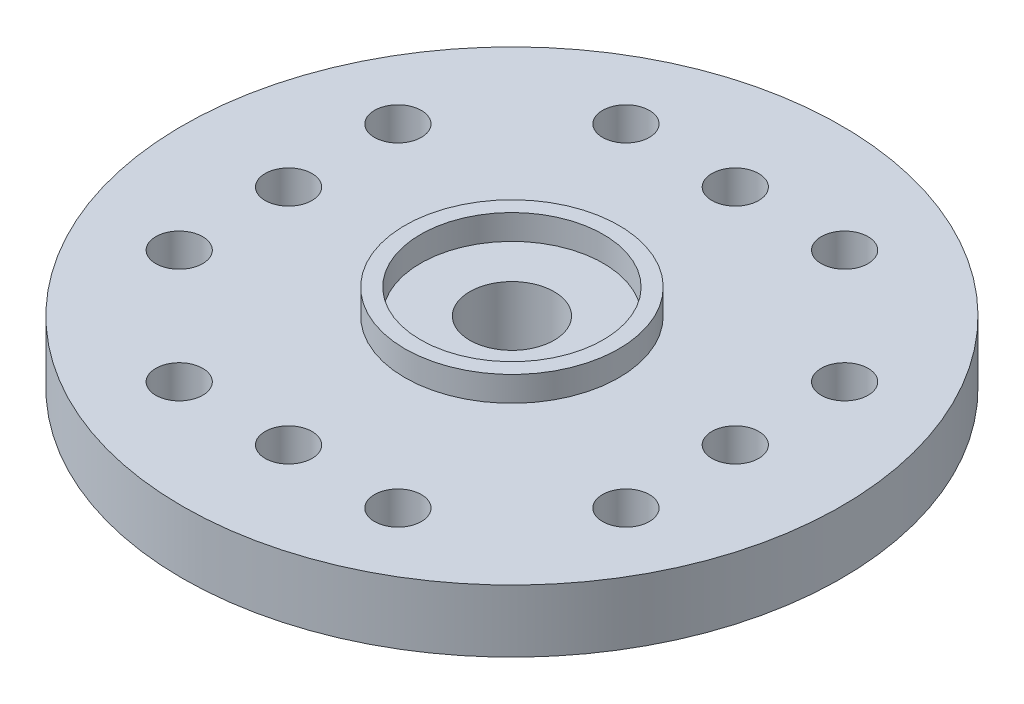
ISO-10303-21;
HEADER;
FILE_DESCRIPTION(('STEP AP214'),'2;1');
FILE_NAME('part.step','',(''),(''),'','','');
FILE_SCHEMA(('AUTOMOTIVE_DESIGN { 1 0 10303 214 1 1 1 1 }'));
ENDSEC;
DATA;
#1=APPLICATION_CONTEXT('core data for automotive mechanical design processes');
#2=APPLICATION_PROTOCOL_DEFINITION('international standard','automotive_design',2000,#1);
#3=PRODUCT_CONTEXT('',#1,'mechanical');
#4=PRODUCT('Part','Part','',(#3));
#5=PRODUCT_RELATED_PRODUCT_CATEGORY('part','',(#4));
#6=PRODUCT_DEFINITION_FORMATION('','',#4);
#7=PRODUCT_DEFINITION_CONTEXT('part definition',#1,'design');
#8=PRODUCT_DEFINITION('design','',#6,#7);
#9=PRODUCT_DEFINITION_SHAPE('','',#8);
#10=(LENGTH_UNIT() NAMED_UNIT(*) SI_UNIT(.MILLI.,.METRE.));
#11=(NAMED_UNIT(*) PLANE_ANGLE_UNIT() SI_UNIT($,.RADIAN.));
#12=(NAMED_UNIT(*) SI_UNIT($,.STERADIAN.) SOLID_ANGLE_UNIT());
#13=UNCERTAINTY_MEASURE_WITH_UNIT(LENGTH_MEASURE(1.E-05),#10,'distance_accuracy_value','');
#14=(GEOMETRIC_REPRESENTATION_CONTEXT(3) GLOBAL_UNCERTAINTY_ASSIGNED_CONTEXT((#13)) GLOBAL_UNIT_ASSIGNED_CONTEXT((#10,
#11,#12)) REPRESENTATION_CONTEXT('',''));
#15=CARTESIAN_POINT('',(0.,0.,0.));
#16=DIRECTION('',(0.,0.,1.));
#17=DIRECTION('',(1.,0.,0.));
#18=AXIS2_PLACEMENT_3D('',#15,#16,#17);
#19=CARTESIAN_POINT('',(0.,4.6,0.));
#20=DIRECTION('',(0.,1.,0.));
#21=DIRECTION('',(0.,0.,1.));
#22=AXIS2_PLACEMENT_3D('',#19,#20,#21);
#23=PLANE('',#22);
#24=CARTESIAN_POINT('',(0.,4.6,0.));
#25=DIRECTION('',(0.,1.,0.));
#26=DIRECTION('',(0.,0.,1.));
#27=AXIS2_PLACEMENT_3D('',#24,#25,#26);
#28=CIRCLE('',#27,1.35);
#29=CARTESIAN_POINT('',(0.,4.6,1.35));
#30=VERTEX_POINT('',#29);
#31=EDGE_CURVE('E123',#30,#30,#28,.T.);
#32=ORIENTED_EDGE('',*,*,#31,.F.);
#33=EDGE_LOOP('',(#32));
#34=FACE_BOUND('',#33,.T.);
#35=CARTESIAN_POINT('',(0.,4.6,0.));
#36=DIRECTION('',(0.,1.,0.));
#37=DIRECTION('',(0.,0.,1.));
#38=AXIS2_PLACEMENT_3D('',#35,#36,#37);
#39=CIRCLE('',#38,2.925);
#40=CARTESIAN_POINT('',(0.,4.6,2.925));
#41=VERTEX_POINT('',#40);
#42=EDGE_CURVE('E10',#41,#41,#39,.F.);
#43=ORIENTED_EDGE('',*,*,#42,.F.);
#44=EDGE_LOOP('',(#43));
#45=FACE_BOUND('',#44,.T.);
#46=ADVANCED_FACE('F37',(#34,#45),#23,.T.);
#47=CARTESIAN_POINT('',(0.,2.6,0.));
#48=DIRECTION('',(0.,-1.,0.));
#49=DIRECTION('',(0.,0.,-1.));
#50=AXIS2_PLACEMENT_3D('',#47,#48,#49);
#51=CYLINDRICAL_SURFACE('',#50,4.35);
#52=CARTESIAN_POINT('',(0.,2.6,0.));
#53=DIRECTION('',(0.,1.,0.));
#54=DIRECTION('',(0.,0.,1.));
#55=AXIS2_PLACEMENT_3D('',#52,#53,#54);
#56=CIRCLE('',#55,4.35);
#57=CARTESIAN_POINT('',(0.,2.6,4.35));
#58=VERTEX_POINT('',#57);
#59=EDGE_CURVE('E46',#58,#58,#56,.T.);
#60=ORIENTED_EDGE('',*,*,#59,.F.);
#61=EDGE_LOOP('',(#60));
#62=FACE_BOUND('',#61,.T.);
#63=CARTESIAN_POINT('',(0.,0.,0.));
#64=DIRECTION('',(0.,1.,0.));
#65=DIRECTION('',(0.,0.,1.));
#66=AXIS2_PLACEMENT_3D('',#63,#64,#65);
#67=CIRCLE('',#66,4.35);
#68=CARTESIAN_POINT('',(0.,0.,4.35));
#69=VERTEX_POINT('',#68);
#70=EDGE_CURVE('E52',#69,#69,#67,.T.);
#71=ORIENTED_EDGE('',*,*,#70,.T.);
#72=EDGE_LOOP('',(#71));
#73=FACE_BOUND('',#72,.T.);
#74=ADVANCED_FACE('F39',(#62,#73),#51,.T.);
#75=CARTESIAN_POINT('',(0.,0.,0.));
#76=DIRECTION('',(0.,1.,0.));
#77=DIRECTION('',(0.,0.,1.));
#78=AXIS2_PLACEMENT_3D('',#75,#76,#77);
#79=PLANE('',#78);
#80=CARTESIAN_POINT('',(0.,0.,0.));
#81=DIRECTION('',(0.,-1.,0.));
#82=DIRECTION('',(0.,0.,-1.));
#83=AXIS2_PLACEMENT_3D('',#80,#81,#82);
#84=CIRCLE('',#83,2.45);
#85=CARTESIAN_POINT('',(0.,0.,-2.45));
#86=VERTEX_POINT('',#85);
#87=EDGE_CURVE('E139',#86,#86,#84,.T.);
#88=ORIENTED_EDGE('',*,*,#87,.F.);
#89=EDGE_LOOP('',(#88));
#90=FACE_BOUND('',#89,.T.);
#91=ORIENTED_EDGE('',*,*,#70,.F.);
#92=EDGE_LOOP('',(#91));
#93=FACE_BOUND('',#92,.T.);
#94=ADVANCED_FACE('F162',(#90,#93),#79,.F.);
#95=CARTESIAN_POINT('',(0.,3.,0.));
#96=DIRECTION('',(0.,-1.,0.));
#97=DIRECTION('',(0.,0.,-1.));
#98=AXIS2_PLACEMENT_3D('',#95,#96,#97);
#99=CYLINDRICAL_SURFACE('',#98,2.45);
#100=CARTESIAN_POINT('',(0.,2.6,0.));
#101=DIRECTION('',(0.,1.,0.));
#102=DIRECTION('',(0.,0.,1.));
#103=AXIS2_PLACEMENT_3D('',#100,#101,#102);
#104=CIRCLE('',#103,2.45);
#105=CARTESIAN_POINT('',(0.,2.6,2.45));
#106=VERTEX_POINT('',#105);
#107=EDGE_CURVE('E135',#106,#106,#104,.T.);
#108=ORIENTED_EDGE('',*,*,#107,.T.);
#109=EDGE_LOOP('',(#108));
#110=FACE_BOUND('',#109,.T.);
#111=ORIENTED_EDGE('',*,*,#87,.T.);
#112=EDGE_LOOP('',(#111));
#113=FACE_BOUND('',#112,.T.);
#114=ADVANCED_FACE('F147',(#110,#113),#99,.F.);
#115=CARTESIAN_POINT('',(0.,2.6,0.));
#116=DIRECTION('',(0.,1.,0.));
#117=DIRECTION('',(0.,0.,1.));
#118=AXIS2_PLACEMENT_3D('',#115,#116,#117);
#119=PLANE('',#118);
#120=CARTESIAN_POINT('',(0.,2.6,0.));
#121=DIRECTION('',(0.,1.,0.));
#122=DIRECTION('',(0.,0.,1.));
#123=AXIS2_PLACEMENT_3D('',#120,#121,#122);
#124=CIRCLE('',#123,1.35);
#125=CARTESIAN_POINT('',(0.,2.6,1.35));
#126=VERTEX_POINT('',#125);
#127=EDGE_CURVE('E121',#126,#126,#124,.T.);
#128=ORIENTED_EDGE('',*,*,#127,.T.);
#129=EDGE_LOOP('',(#128));
#130=FACE_BOUND('',#129,.T.);
#131=ORIENTED_EDGE('',*,*,#107,.F.);
#132=EDGE_LOOP('',(#131));
#133=FACE_BOUND('',#132,.T.);
#134=ADVANCED_FACE('F150',(#130,#133),#119,.F.);
#135=CARTESIAN_POINT('',(-7.15,4.6,3.50000000000001));
#136=DIRECTION('',(0.,1.,0.));
#137=DIRECTION('',(0.,0.,1.));
#138=AXIS2_PLACEMENT_3D('',#135,#136,#137);
#139=CIRCLE('',#138,0.75);
#140=CARTESIAN_POINT('',(-7.15,4.6,4.25000000000001));
#141=VERTEX_POINT('',#140);
#142=EDGE_CURVE('E449',#141,#141,#139,.T.);
#143=ORIENTED_EDGE('',*,*,#142,.F.);
#144=EDGE_LOOP('',(#143));
#145=FACE_BOUND('',#144,.T.);
#146=CARTESIAN_POINT('',(-7.15,4.6,-3.49999999999999));
#147=DIRECTION('',(0.,1.,0.));
#148=DIRECTION('',(0.,0.,1.));
#149=AXIS2_PLACEMENT_3D('',#146,#147,#148);
#150=CIRCLE('',#149,0.75);
#151=CARTESIAN_POINT('',(-7.15,4.6,-2.74999999999999));
#152=VERTEX_POINT('',#151);
#153=EDGE_CURVE('E446',#152,#152,#150,.T.);
#154=ORIENTED_EDGE('',*,*,#153,.F.);
#155=EDGE_LOOP('',(#154));
#156=FACE_BOUND('',#155,.T.);
#157=CARTESIAN_POINT('',(-7.15,4.6,0.));
#158=DIRECTION('',(0.,1.,0.));
#159=DIRECTION('',(0.,0.,1.));
#160=AXIS2_PLACEMENT_3D('',#157,#158,#159);
#161=CIRCLE('',#160,0.75);
#162=CARTESIAN_POINT('',(-7.15,4.6,0.75));
#163=VERTEX_POINT('',#162);
#164=EDGE_CURVE('E421',#163,#163,#161,.T.);
#165=ORIENTED_EDGE('',*,*,#164,.F.);
#166=EDGE_LOOP('',(#165));
#167=FACE_BOUND('',#166,.T.);
#168=CARTESIAN_POINT('',(3.5,4.6,-7.15));
#169=DIRECTION('',(0.,1.,0.));
#170=DIRECTION('',(0.,0.,1.));
#171=AXIS2_PLACEMENT_3D('',#168,#169,#170);
#172=CIRCLE('',#171,0.750000000000001);
#173=CARTESIAN_POINT('',(3.5,4.6,-6.4));
#174=VERTEX_POINT('',#173);
#175=EDGE_CURVE('E428',#174,#174,#172,.T.);
#176=ORIENTED_EDGE('',*,*,#175,.F.);
#177=EDGE_LOOP('',(#176));
#178=FACE_BOUND('',#177,.T.);
#179=CARTESIAN_POINT('',(-3.5,4.6,-7.15));
#180=DIRECTION('',(0.,1.,0.));
#181=DIRECTION('',(0.,0.,1.));
#182=AXIS2_PLACEMENT_3D('',#179,#180,#181);
#183=CIRCLE('',#182,0.75);
#184=CARTESIAN_POINT('',(-3.5,4.6,-6.4));
#185=VERTEX_POINT('',#184);
#186=EDGE_CURVE('E432',#185,#185,#183,.T.);
#187=ORIENTED_EDGE('',*,*,#186,.F.);
#188=EDGE_LOOP('',(#187));
#189=FACE_BOUND('',#188,.T.);
#190=CARTESIAN_POINT('',(7.15000000000001,4.6,0.));
#191=DIRECTION('',(0.,1.,0.));
#192=DIRECTION('',(0.,0.,1.));
#193=AXIS2_PLACEMENT_3D('',#190,#191,#192);
#194=CIRCLE('',#193,0.749999999999999);
#195=CARTESIAN_POINT('',(7.15000000000001,4.6,0.75000000000001));
#196=VERTEX_POINT('',#195);
#197=EDGE_CURVE('E436',#196,#196,#194,.T.);
#198=ORIENTED_EDGE('',*,*,#197,.F.);
#199=EDGE_LOOP('',(#198));
#200=FACE_BOUND('',#199,.T.);
#201=CARTESIAN_POINT('',(7.15000000000001,4.6,3.5));
#202=DIRECTION('',(0.,1.,0.));
#203=DIRECTION('',(0.,0.,1.));
#204=AXIS2_PLACEMENT_3D('',#201,#202,#203);
#205=CIRCLE('',#204,0.749999999999999);
#206=CARTESIAN_POINT('',(7.15000000000001,4.6,4.25));
#207=VERTEX_POINT('',#206);
#208=EDGE_CURVE('E426',#207,#207,#205,.T.);
#209=ORIENTED_EDGE('',*,*,#208,.F.);
#210=EDGE_LOOP('',(#209));
#211=FACE_BOUND('',#210,.T.);
#212=CARTESIAN_POINT('',(3.50000000000001,4.6,7.15000000000001));
#213=DIRECTION('',(0.,1.,0.));
#214=DIRECTION('',(0.,0.,1.));
#215=AXIS2_PLACEMENT_3D('',#212,#213,#214);
#216=CIRCLE('',#215,0.75);
#217=CARTESIAN_POINT('',(3.50000000000001,4.6,7.90000000000001));
#218=VERTEX_POINT('',#217);
#219=EDGE_CURVE('E413',#218,#218,#216,.T.);
#220=ORIENTED_EDGE('',*,*,#219,.F.);
#221=EDGE_LOOP('',(#220));
#222=FACE_BOUND('',#221,.T.);
#223=CARTESIAN_POINT('',(-3.49999999999999,4.6,7.15000000000001));
#224=DIRECTION('',(0.,1.,0.));
#225=DIRECTION('',(0.,0.,1.));
#226=AXIS2_PLACEMENT_3D('',#223,#224,#225);
#227=CIRCLE('',#226,0.75);
#228=CARTESIAN_POINT('',(-3.49999999999999,4.6,7.90000000000001));
#229=VERTEX_POINT('',#228);
#230=EDGE_CURVE('E243',#229,#229,#227,.T.);
#231=ORIENTED_EDGE('',*,*,#230,.F.);
#232=EDGE_LOOP('',(#231));
#233=FACE_BOUND('',#232,.T.);
#234=CARTESIAN_POINT('',(0.,4.6,7.15000000000001));
#235=DIRECTION('',(0.,1.,0.));
#236=DIRECTION('',(0.,0.,1.));
#237=AXIS2_PLACEMENT_3D('',#234,#235,#236);
#238=CIRCLE('',#237,0.75);
#239=CARTESIAN_POINT('',(0.,4.6,7.90000000000001));
#240=VERTEX_POINT('',#239);
#241=EDGE_CURVE('E412',#240,#240,#238,.T.);
#242=ORIENTED_EDGE('',*,*,#241,.F.);
#243=EDGE_LOOP('',(#242));
#244=FACE_BOUND('',#243,.T.);
#245=CARTESIAN_POINT('',(7.15000000000001,4.6,-3.5));
#246=DIRECTION('',(0.,1.,0.));
#247=DIRECTION('',(0.,0.,1.));
#248=AXIS2_PLACEMENT_3D('',#245,#246,#247);
#249=CIRCLE('',#248,0.749999999999999);
#250=CARTESIAN_POINT('',(7.15000000000001,4.6,-2.75));
#251=VERTEX_POINT('',#250);
#252=EDGE_CURVE('E418',#251,#251,#249,.T.);
#253=ORIENTED_EDGE('',*,*,#252,.F.);
#254=EDGE_LOOP('',(#253));
#255=FACE_BOUND('',#254,.T.);
#256=CARTESIAN_POINT('',(0.,4.6,-7.15));
#257=DIRECTION('',(0.,1.,0.));
#258=DIRECTION('',(0.,0.,1.));
#259=AXIS2_PLACEMENT_3D('',#256,#257,#258);
#260=CIRCLE('',#259,0.75);
#261=CARTESIAN_POINT('',(0.,4.6,-6.4));
#262=VERTEX_POINT('',#261);
#263=EDGE_CURVE('E61',#262,#262,#260,.T.);
#264=ORIENTED_EDGE('',*,*,#263,.F.);
#265=EDGE_LOOP('',(#264));
#266=FACE_BOUND('',#265,.T.);
#267=CARTESIAN_POINT('',(0.,4.6,0.));
#268=DIRECTION('',(0.,1.,0.));
#269=DIRECTION('',(0.,0.,1.));
#270=AXIS2_PLACEMENT_3D('',#267,#268,#269);
#271=CIRCLE('',#270,3.425);
#272=CARTESIAN_POINT('',(0.,4.6,3.425));
#273=VERTEX_POINT('',#272);
#274=EDGE_CURVE('E108',#273,#273,#271,.T.);
#275=ORIENTED_EDGE('',*,*,#274,.F.);
#276=EDGE_LOOP('',(#275));
#277=FACE_BOUND('',#276,.T.);
#278=CARTESIAN_POINT('',(0.,4.6,0.));
#279=DIRECTION('',(0.,1.,0.));
#280=DIRECTION('',(0.,0.,1.));
#281=AXIS2_PLACEMENT_3D('',#278,#279,#280);
#282=CIRCLE('',#281,10.55);
#283=CARTESIAN_POINT('',(0.,4.6,10.55));
#284=VERTEX_POINT('',#283);
#285=EDGE_CURVE('E131',#284,#284,#282,.T.);
#286=ORIENTED_EDGE('',*,*,#285,.T.);
#287=EDGE_LOOP('',(#286));
#288=FACE_BOUND('',#287,.T.);
#289=ADVANCED_FACE('F152',(#145,#156,#167,#178,#189,#200,#211,#222,#233,#244,#255,#266,#277,
#288),#23,.T.);
#290=CARTESIAN_POINT('',(-7.15,2.6,3.50000000000001));
#291=DIRECTION('',(0.,1.,0.));
#292=DIRECTION('',(0.,0.,1.));
#293=AXIS2_PLACEMENT_3D('',#290,#291,#292);
#294=CIRCLE('',#293,0.75);
#295=CARTESIAN_POINT('',(-7.15,2.6,4.25000000000001));
#296=VERTEX_POINT('',#295);
#297=EDGE_CURVE('E41',#296,#296,#294,.T.);
#298=ORIENTED_EDGE('',*,*,#297,.T.);
#299=EDGE_LOOP('',(#298));
#300=FACE_BOUND('',#299,.T.);
#301=CARTESIAN_POINT('',(-7.15,2.6,-3.49999999999999));
#302=DIRECTION('',(0.,1.,0.));
#303=DIRECTION('',(0.,0.,1.));
#304=AXIS2_PLACEMENT_3D('',#301,#302,#303);
#305=CIRCLE('',#304,0.75);
#306=CARTESIAN_POINT('',(-7.15,2.6,-2.74999999999999));
#307=VERTEX_POINT('',#306);
#308=EDGE_CURVE('E96',#307,#307,#305,.T.);
#309=ORIENTED_EDGE('',*,*,#308,.T.);
#310=EDGE_LOOP('',(#309));
#311=FACE_BOUND('',#310,.T.);
#312=CARTESIAN_POINT('',(-7.15,2.6,0.));
#313=DIRECTION('',(0.,1.,0.));
#314=DIRECTION('',(0.,0.,1.));
#315=AXIS2_PLACEMENT_3D('',#312,#313,#314);
#316=CIRCLE('',#315,0.75);
#317=CARTESIAN_POINT('',(-7.15,2.6,0.75));
#318=VERTEX_POINT('',#317);
#319=EDGE_CURVE('E93',#318,#318,#316,.T.);
#320=ORIENTED_EDGE('',*,*,#319,.T.);
#321=EDGE_LOOP('',(#320));
#322=FACE_BOUND('',#321,.T.);
#323=CARTESIAN_POINT('',(3.5,2.6,-7.15));
#324=DIRECTION('',(0.,1.,0.));
#325=DIRECTION('',(0.,0.,1.));
#326=AXIS2_PLACEMENT_3D('',#323,#324,#325);
#327=CIRCLE('',#326,0.750000000000001);
#328=CARTESIAN_POINT('',(3.5,2.6,-6.4));
#329=VERTEX_POINT('',#328);
#330=EDGE_CURVE('E89',#329,#329,#327,.T.);
#331=ORIENTED_EDGE('',*,*,#330,.T.);
#332=EDGE_LOOP('',(#331));
#333=FACE_BOUND('',#332,.T.);
#334=CARTESIAN_POINT('',(-3.5,2.6,-7.15));
#335=DIRECTION('',(0.,1.,0.));
#336=DIRECTION('',(0.,0.,1.));
#337=AXIS2_PLACEMENT_3D('',#334,#335,#336);
#338=CIRCLE('',#337,0.75);
#339=CARTESIAN_POINT('',(-3.5,2.6,-6.4));
#340=VERTEX_POINT('',#339);
#341=EDGE_CURVE('E85',#340,#340,#338,.T.);
#342=ORIENTED_EDGE('',*,*,#341,.T.);
#343=EDGE_LOOP('',(#342));
#344=FACE_BOUND('',#343,.T.);
#345=CARTESIAN_POINT('',(7.15000000000001,2.6,0.));
#346=DIRECTION('',(0.,1.,0.));
#347=DIRECTION('',(0.,0.,1.));
#348=AXIS2_PLACEMENT_3D('',#345,#346,#347);
#349=CIRCLE('',#348,0.749999999999999);
#350=CARTESIAN_POINT('',(7.15000000000001,2.6,0.75000000000001));
#351=VERTEX_POINT('',#350);
#352=EDGE_CURVE('E81',#351,#351,#349,.T.);
#353=ORIENTED_EDGE('',*,*,#352,.T.);
#354=EDGE_LOOP('',(#353));
#355=FACE_BOUND('',#354,.T.);
#356=CARTESIAN_POINT('',(7.15000000000001,2.6,3.5));
#357=DIRECTION('',(0.,1.,0.));
#358=DIRECTION('',(0.,0.,1.));
#359=AXIS2_PLACEMENT_3D('',#356,#357,#358);
#360=CIRCLE('',#359,0.749999999999999);
#361=CARTESIAN_POINT('',(7.15000000000001,2.6,4.25));
#362=VERTEX_POINT('',#361);
#363=EDGE_CURVE('E77',#362,#362,#360,.T.);
#364=ORIENTED_EDGE('',*,*,#363,.T.);
#365=EDGE_LOOP('',(#364));
#366=FACE_BOUND('',#365,.T.);
#367=CARTESIAN_POINT('',(3.50000000000001,2.6,7.15000000000001));
#368=DIRECTION('',(0.,1.,0.));
#369=DIRECTION('',(0.,0.,1.));
#370=AXIS2_PLACEMENT_3D('',#367,#368,#369);
#371=CIRCLE('',#370,0.75);
#372=CARTESIAN_POINT('',(3.50000000000001,2.6,7.90000000000001));
#373=VERTEX_POINT('',#372);
#374=EDGE_CURVE('E73',#373,#373,#371,.T.);
#375=ORIENTED_EDGE('',*,*,#374,.T.);
#376=EDGE_LOOP('',(#375));
#377=FACE_BOUND('',#376,.T.);
#378=CARTESIAN_POINT('',(-3.49999999999999,2.6,7.15000000000001));
#379=DIRECTION('',(0.,1.,0.));
#380=DIRECTION('',(0.,0.,1.));
#381=AXIS2_PLACEMENT_3D('',#378,#379,#380);
#382=CIRCLE('',#381,0.75);
#383=CARTESIAN_POINT('',(-3.49999999999999,2.6,7.90000000000001));
#384=VERTEX_POINT('',#383);
#385=EDGE_CURVE('E69',#384,#384,#382,.T.);
#386=ORIENTED_EDGE('',*,*,#385,.T.);
#387=EDGE_LOOP('',(#386));
#388=FACE_BOUND('',#387,.T.);
#389=CARTESIAN_POINT('',(0.,2.6,7.15000000000001));
#390=DIRECTION('',(0.,1.,0.));
#391=DIRECTION('',(0.,0.,1.));
#392=AXIS2_PLACEMENT_3D('',#389,#390,#391);
#393=CIRCLE('',#392,0.75);
#394=CARTESIAN_POINT('',(0.,2.6,7.90000000000001));
#395=VERTEX_POINT('',#394);
#396=EDGE_CURVE('E65',#395,#395,#393,.T.);
#397=ORIENTED_EDGE('',*,*,#396,.T.);
#398=EDGE_LOOP('',(#397));
#399=FACE_BOUND('',#398,.T.);
#400=CARTESIAN_POINT('',(7.15000000000001,2.6,-3.5));
#401=DIRECTION('',(0.,1.,0.));
#402=DIRECTION('',(0.,0.,1.));
#403=AXIS2_PLACEMENT_3D('',#400,#401,#402);
#404=CIRCLE('',#403,0.749999999999999);
#405=CARTESIAN_POINT('',(7.15000000000001,2.6,-2.75));
#406=VERTEX_POINT('',#405);
#407=EDGE_CURVE('E60',#406,#406,#404,.T.);
#408=ORIENTED_EDGE('',*,*,#407,.T.);
#409=EDGE_LOOP('',(#408));
#410=FACE_BOUND('',#409,.T.);
#411=CARTESIAN_POINT('',(0.,2.6,-7.15));
#412=DIRECTION('',(0.,1.,0.));
#413=DIRECTION('',(0.,0.,1.));
#414=AXIS2_PLACEMENT_3D('',#411,#412,#413);
#415=CIRCLE('',#414,0.75);
#416=CARTESIAN_POINT('',(0.,2.6,-6.4));
#417=VERTEX_POINT('',#416);
#418=EDGE_CURVE('E56',#417,#417,#415,.T.);
#419=ORIENTED_EDGE('',*,*,#418,.T.);
#420=EDGE_LOOP('',(#419));
#421=FACE_BOUND('',#420,.T.);
#422=ORIENTED_EDGE('',*,*,#59,.T.);
#423=EDGE_LOOP('',(#422));
#424=FACE_BOUND('',#423,.T.);
#425=CARTESIAN_POINT('',(0.,2.6,0.));
#426=DIRECTION('',(0.,1.,0.));
#427=DIRECTION('',(0.,0.,1.));
#428=AXIS2_PLACEMENT_3D('',#425,#426,#427);
#429=CIRCLE('',#428,10.55);
#430=CARTESIAN_POINT('',(0.,2.6,10.55));
#431=VERTEX_POINT('',#430);
#432=EDGE_CURVE('E127',#431,#431,#429,.T.);
#433=ORIENTED_EDGE('',*,*,#432,.F.);
#434=EDGE_LOOP('',(#433));
#435=FACE_BOUND('',#434,.T.);
#436=ADVANCED_FACE('F155',(#300,#311,#322,#333,#344,#355,#366,#377,#388,#399,#410,#421,#424,
#435),#119,.F.);
#437=CARTESIAN_POINT('',(0.,4.6,0.));
#438=DIRECTION('',(0.,-1.,0.));
#439=DIRECTION('',(0.,0.,-1.));
#440=AXIS2_PLACEMENT_3D('',#437,#438,#439);
#441=CYLINDRICAL_SURFACE('',#440,10.55);
#442=ORIENTED_EDGE('',*,*,#285,.F.);
#443=EDGE_LOOP('',(#442));
#444=FACE_BOUND('',#443,.T.);
#445=ORIENTED_EDGE('',*,*,#432,.T.);
#446=EDGE_LOOP('',(#445));
#447=FACE_BOUND('',#446,.T.);
#448=ADVANCED_FACE('F166',(#444,#447),#441,.T.);
#449=CARTESIAN_POINT('',(0.,4.6,0.));
#450=DIRECTION('',(0.,-1.,0.));
#451=DIRECTION('',(0.,0.,-1.));
#452=AXIS2_PLACEMENT_3D('',#449,#450,#451);
#453=CYLINDRICAL_SURFACE('',#452,1.35);
#454=ORIENTED_EDGE('',*,*,#31,.T.);
#455=EDGE_LOOP('',(#454));
#456=FACE_BOUND('',#455,.T.);
#457=ORIENTED_EDGE('',*,*,#127,.F.);
#458=EDGE_LOOP('',(#457));
#459=FACE_BOUND('',#458,.T.);
#460=ADVANCED_FACE('F176',(#456,#459),#453,.F.);
#461=CARTESIAN_POINT('',(0.,5.4,0.));
#462=DIRECTION('',(0.,1.,0.));
#463=DIRECTION('',(0.,0.,1.));
#464=AXIS2_PLACEMENT_3D('',#461,#462,#463);
#465=PLANE('',#464);
#466=CARTESIAN_POINT('',(0.,5.4,0.));
#467=DIRECTION('',(0.,1.,0.));
#468=DIRECTION('',(0.,0.,1.));
#469=AXIS2_PLACEMENT_3D('',#466,#467,#468);
#470=CIRCLE('',#469,3.425);
#471=CARTESIAN_POINT('',(0.,5.4,3.425));
#472=VERTEX_POINT('',#471);
#473=EDGE_CURVE('E114',#472,#472,#470,.T.);
#474=ORIENTED_EDGE('',*,*,#473,.T.);
#475=EDGE_LOOP('',(#474));
#476=FACE_BOUND('',#475,.T.);
#477=CARTESIAN_POINT('',(0.,5.4,0.));
#478=DIRECTION('',(0.,1.,0.));
#479=DIRECTION('',(0.,0.,1.));
#480=AXIS2_PLACEMENT_3D('',#477,#478,#479);
#481=CIRCLE('',#480,2.925);
#482=CARTESIAN_POINT('',(0.,5.4,2.925));
#483=VERTEX_POINT('',#482);
#484=EDGE_CURVE('E103',#483,#483,#481,.T.);
#485=ORIENTED_EDGE('',*,*,#484,.F.);
#486=EDGE_LOOP('',(#485));
#487=FACE_BOUND('',#486,.T.);
#488=ADVANCED_FACE('F179',(#476,#487),#465,.T.);
#489=CARTESIAN_POINT('',(0.,5.4,0.));
#490=DIRECTION('',(0.,-1.,0.));
#491=DIRECTION('',(0.,0.,-1.));
#492=AXIS2_PLACEMENT_3D('',#489,#490,#491);
#493=CYLINDRICAL_SURFACE('',#492,3.425);
#494=ORIENTED_EDGE('',*,*,#473,.F.);
#495=EDGE_LOOP('',(#494));
#496=FACE_BOUND('',#495,.T.);
#497=ORIENTED_EDGE('',*,*,#274,.T.);
#498=EDGE_LOOP('',(#497));
#499=FACE_BOUND('',#498,.T.);
#500=ADVANCED_FACE('F181',(#496,#499),#493,.T.);
#501=CARTESIAN_POINT('',(0.,5.4,0.));
#502=DIRECTION('',(0.,-1.,0.));
#503=DIRECTION('',(0.,0.,-1.));
#504=AXIS2_PLACEMENT_3D('',#501,#502,#503);
#505=CYLINDRICAL_SURFACE('',#504,2.925);
#506=ORIENTED_EDGE('',*,*,#484,.T.);
#507=EDGE_LOOP('',(#506));
#508=FACE_BOUND('',#507,.T.);
#509=ORIENTED_EDGE('',*,*,#42,.T.);
#510=EDGE_LOOP('',(#509));
#511=FACE_BOUND('',#510,.T.);
#512=ADVANCED_FACE('F184',(#508,#511),#505,.F.);
#513=CARTESIAN_POINT('',(0.,0.,-7.15));
#514=DIRECTION('',(0.,1.,0.));
#515=DIRECTION('',(0.,0.,1.));
#516=AXIS2_PLACEMENT_3D('',#513,#514,#515);
#517=CYLINDRICAL_SURFACE('',#516,0.75);
#518=ORIENTED_EDGE('',*,*,#263,.T.);
#519=EDGE_LOOP('',(#518));
#520=FACE_BOUND('',#519,.T.);
#521=ORIENTED_EDGE('',*,*,#418,.F.);
#522=EDGE_LOOP('',(#521));
#523=FACE_BOUND('',#522,.T.);
#524=ADVANCED_FACE('F191',(#520,#523),#517,.F.);
#525=CARTESIAN_POINT('',(7.15000000000001,0.,-3.5));
#526=DIRECTION('',(0.,1.,0.));
#527=DIRECTION('',(0.,0.,1.));
#528=AXIS2_PLACEMENT_3D('',#525,#526,#527);
#529=CYLINDRICAL_SURFACE('',#528,0.749999999999999);
#530=ORIENTED_EDGE('',*,*,#252,.T.);
#531=EDGE_LOOP('',(#530));
#532=FACE_BOUND('',#531,.T.);
#533=ORIENTED_EDGE('',*,*,#407,.F.);
#534=EDGE_LOOP('',(#533));
#535=FACE_BOUND('',#534,.T.);
#536=ADVANCED_FACE('F194',(#532,#535),#529,.F.);
#537=CARTESIAN_POINT('',(0.,0.,7.15000000000001));
#538=DIRECTION('',(0.,1.,0.));
#539=DIRECTION('',(0.,0.,1.));
#540=AXIS2_PLACEMENT_3D('',#537,#538,#539);
#541=CYLINDRICAL_SURFACE('',#540,0.75);
#542=ORIENTED_EDGE('',*,*,#241,.T.);
#543=EDGE_LOOP('',(#542));
#544=FACE_BOUND('',#543,.T.);
#545=ORIENTED_EDGE('',*,*,#396,.F.);
#546=EDGE_LOOP('',(#545));
#547=FACE_BOUND('',#546,.T.);
#548=ADVANCED_FACE('F225',(#544,#547),#541,.F.);
#549=CARTESIAN_POINT('',(-3.49999999999999,0.,7.15000000000001));
#550=DIRECTION('',(0.,1.,0.));
#551=DIRECTION('',(0.,0.,1.));
#552=AXIS2_PLACEMENT_3D('',#549,#550,#551);
#553=CYLINDRICAL_SURFACE('',#552,0.75);
#554=ORIENTED_EDGE('',*,*,#230,.T.);
#555=EDGE_LOOP('',(#554));
#556=FACE_BOUND('',#555,.T.);
#557=ORIENTED_EDGE('',*,*,#385,.F.);
#558=EDGE_LOOP('',(#557));
#559=FACE_BOUND('',#558,.T.);
#560=ADVANCED_FACE('F228',(#556,#559),#553,.F.);
#561=CARTESIAN_POINT('',(3.50000000000001,0.,7.15000000000001));
#562=DIRECTION('',(0.,1.,0.));
#563=DIRECTION('',(0.,0.,1.));
#564=AXIS2_PLACEMENT_3D('',#561,#562,#563);
#565=CYLINDRICAL_SURFACE('',#564,0.75);
#566=ORIENTED_EDGE('',*,*,#219,.T.);
#567=EDGE_LOOP('',(#566));
#568=FACE_BOUND('',#567,.T.);
#569=ORIENTED_EDGE('',*,*,#374,.F.);
#570=EDGE_LOOP('',(#569));
#571=FACE_BOUND('',#570,.T.);
#572=ADVANCED_FACE('F213',(#568,#571),#565,.F.);
#573=CARTESIAN_POINT('',(7.15000000000001,0.,3.5));
#574=DIRECTION('',(0.,1.,0.));
#575=DIRECTION('',(0.,0.,1.));
#576=AXIS2_PLACEMENT_3D('',#573,#574,#575);
#577=CYLINDRICAL_SURFACE('',#576,0.749999999999999);
#578=ORIENTED_EDGE('',*,*,#208,.T.);
#579=EDGE_LOOP('',(#578));
#580=FACE_BOUND('',#579,.T.);
#581=ORIENTED_EDGE('',*,*,#363,.F.);
#582=EDGE_LOOP('',(#581));
#583=FACE_BOUND('',#582,.T.);
#584=ADVANCED_FACE('F209',(#580,#583),#577,.F.);
#585=CARTESIAN_POINT('',(7.15000000000001,0.,0.));
#586=DIRECTION('',(0.,1.,0.));
#587=DIRECTION('',(0.,0.,1.));
#588=AXIS2_PLACEMENT_3D('',#585,#586,#587);
#589=CYLINDRICAL_SURFACE('',#588,0.749999999999999);
#590=ORIENTED_EDGE('',*,*,#197,.T.);
#591=EDGE_LOOP('',(#590));
#592=FACE_BOUND('',#591,.T.);
#593=ORIENTED_EDGE('',*,*,#352,.F.);
#594=EDGE_LOOP('',(#593));
#595=FACE_BOUND('',#594,.T.);
#596=ADVANCED_FACE('F212',(#592,#595),#589,.F.);
#597=CARTESIAN_POINT('',(-3.5,0.,-7.15));
#598=DIRECTION('',(0.,1.,0.));
#599=DIRECTION('',(0.,0.,1.));
#600=AXIS2_PLACEMENT_3D('',#597,#598,#599);
#601=CYLINDRICAL_SURFACE('',#600,0.75);
#602=ORIENTED_EDGE('',*,*,#186,.T.);
#603=EDGE_LOOP('',(#602));
#604=FACE_BOUND('',#603,.T.);
#605=ORIENTED_EDGE('',*,*,#341,.F.);
#606=EDGE_LOOP('',(#605));
#607=FACE_BOUND('',#606,.T.);
#608=ADVANCED_FACE('F217',(#604,#607),#601,.F.);
#609=CARTESIAN_POINT('',(3.5,0.,-7.15));
#610=DIRECTION('',(0.,1.,0.));
#611=DIRECTION('',(0.,0.,1.));
#612=AXIS2_PLACEMENT_3D('',#609,#610,#611);
#613=CYLINDRICAL_SURFACE('',#612,0.750000000000001);
#614=ORIENTED_EDGE('',*,*,#175,.T.);
#615=EDGE_LOOP('',(#614));
#616=FACE_BOUND('',#615,.T.);
#617=ORIENTED_EDGE('',*,*,#330,.F.);
#618=EDGE_LOOP('',(#617));
#619=FACE_BOUND('',#618,.T.);
#620=ADVANCED_FACE('F207',(#616,#619),#613,.F.);
#621=CARTESIAN_POINT('',(-7.15,0.,0.));
#622=DIRECTION('',(0.,1.,0.));
#623=DIRECTION('',(0.,0.,1.));
#624=AXIS2_PLACEMENT_3D('',#621,#622,#623);
#625=CYLINDRICAL_SURFACE('',#624,0.75);
#626=ORIENTED_EDGE('',*,*,#164,.T.);
#627=EDGE_LOOP('',(#626));
#628=FACE_BOUND('',#627,.T.);
#629=ORIENTED_EDGE('',*,*,#319,.F.);
#630=EDGE_LOOP('',(#629));
#631=FACE_BOUND('',#630,.T.);
#632=ADVANCED_FACE('F203',(#628,#631),#625,.F.);
#633=CARTESIAN_POINT('',(-7.15,0.,-3.49999999999999));
#634=DIRECTION('',(0.,1.,0.));
#635=DIRECTION('',(0.,0.,1.));
#636=AXIS2_PLACEMENT_3D('',#633,#634,#635);
#637=CYLINDRICAL_SURFACE('',#636,0.75);
#638=ORIENTED_EDGE('',*,*,#153,.T.);
#639=EDGE_LOOP('',(#638));
#640=FACE_BOUND('',#639,.T.);
#641=ORIENTED_EDGE('',*,*,#308,.F.);
#642=EDGE_LOOP('',(#641));
#643=FACE_BOUND('',#642,.T.);
#644=ADVANCED_FACE('F199',(#640,#643),#637,.F.);
#645=CARTESIAN_POINT('',(-7.15,0.,3.50000000000001));
#646=DIRECTION('',(0.,1.,0.));
#647=DIRECTION('',(0.,0.,1.));
#648=AXIS2_PLACEMENT_3D('',#645,#646,#647);
#649=CYLINDRICAL_SURFACE('',#648,0.75);
#650=ORIENTED_EDGE('',*,*,#142,.T.);
#651=EDGE_LOOP('',(#650));
#652=FACE_BOUND('',#651,.T.);
#653=ORIENTED_EDGE('',*,*,#297,.F.);
#654=EDGE_LOOP('',(#653));
#655=FACE_BOUND('',#654,.T.);
#656=ADVANCED_FACE('F196',(#652,#655),#649,.F.);
#657=CLOSED_SHELL('',(#46,#74,#94,#114,#134,#289,#436,#448,#460,#488,#500,#512,#524,#536,#548,
#560,#572,#584,#596,#608,#620,#632,#644,#656));
#658=MANIFOLD_SOLID_BREP('B2',#657);
#659=ADVANCED_BREP_SHAPE_REPRESENTATION('',(#18,#658),#14);
#660=SHAPE_DEFINITION_REPRESENTATION(#9,#659);
ENDSEC;
END-ISO-10303-21;
